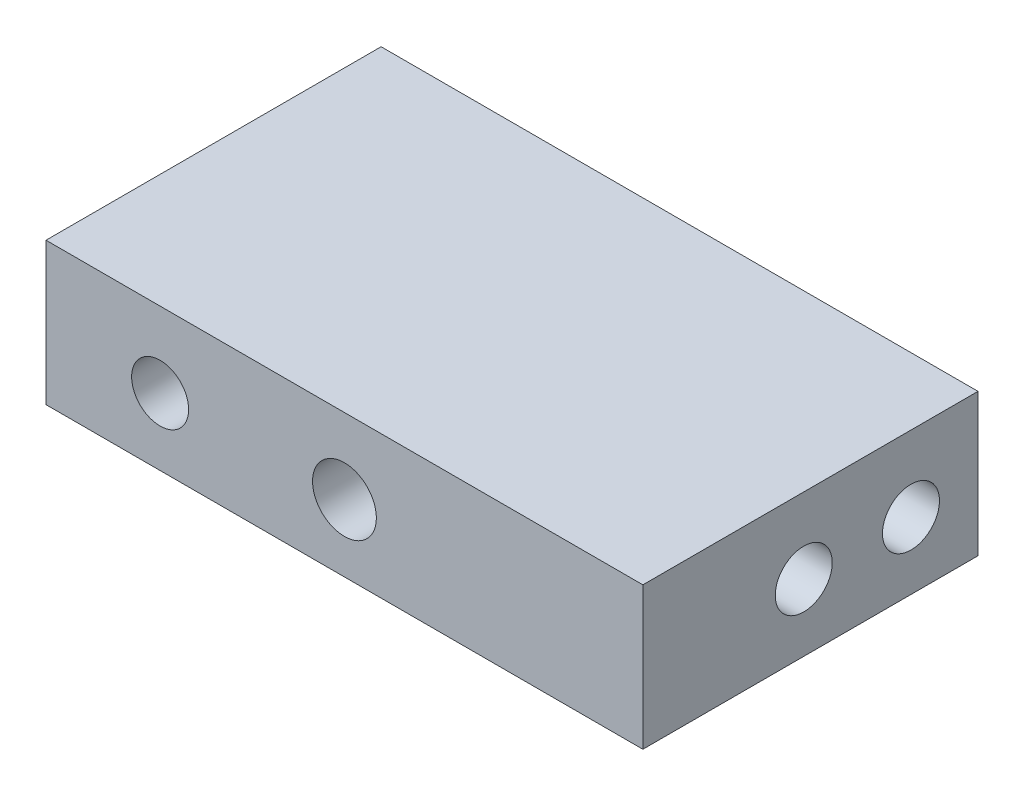
ISO-10303-21;
HEADER;
FILE_DESCRIPTION(('STEP AP214'),'2;1');
FILE_NAME('part.step','',(''),(''),'','','');
FILE_SCHEMA(('AUTOMOTIVE_DESIGN { 1 0 10303 214 1 1 1 1 }'));
ENDSEC;
DATA;
#1=APPLICATION_CONTEXT('core data for automotive mechanical design processes');
#2=APPLICATION_PROTOCOL_DEFINITION('international standard','automotive_design',2000,#1);
#3=PRODUCT_CONTEXT('',#1,'mechanical');
#4=PRODUCT('Part','Part','',(#3));
#5=PRODUCT_RELATED_PRODUCT_CATEGORY('part','',(#4));
#6=PRODUCT_DEFINITION_FORMATION('','',#4);
#7=PRODUCT_DEFINITION_CONTEXT('part definition',#1,'design');
#8=PRODUCT_DEFINITION('design','',#6,#7);
#9=PRODUCT_DEFINITION_SHAPE('','',#8);
#10=(LENGTH_UNIT() NAMED_UNIT(*) SI_UNIT(.MILLI.,.METRE.));
#11=(NAMED_UNIT(*) PLANE_ANGLE_UNIT() SI_UNIT($,.RADIAN.));
#12=(NAMED_UNIT(*) SI_UNIT($,.STERADIAN.) SOLID_ANGLE_UNIT());
#13=UNCERTAINTY_MEASURE_WITH_UNIT(LENGTH_MEASURE(1.E-05),#10,'distance_accuracy_value','');
#14=(GEOMETRIC_REPRESENTATION_CONTEXT(3) GLOBAL_UNCERTAINTY_ASSIGNED_CONTEXT((#13)) GLOBAL_UNIT_ASSIGNED_CONTEXT((#10,
#11,#12)) REPRESENTATION_CONTEXT('',''));
#15=CARTESIAN_POINT('',(0.,0.,0.));
#16=DIRECTION('',(0.,0.,1.));
#17=DIRECTION('',(1.,0.,0.));
#18=AXIS2_PLACEMENT_3D('',#15,#16,#17);
#19=CARTESIAN_POINT('',(-28.275,6.35,31.75));
#20=DIRECTION('',(1.,0.,0.));
#21=DIRECTION('',(0.,0.,-1.));
#22=AXIS2_PLACEMENT_3D('',#19,#20,#21);
#23=PLANE('',#22);
#24=CARTESIAN_POINT('',(-28.275,0.,6.35));
#25=DIRECTION('',(-1.,0.,0.));
#26=DIRECTION('',(0.,0.,1.));
#27=AXIS2_PLACEMENT_3D('',#24,#25,#26);
#28=CIRCLE('',#27,2.7);
#29=CARTESIAN_POINT('',(-28.275,0.,9.05));
#30=VERTEX_POINT('',#29);
#31=EDGE_CURVE('E119',#30,#30,#28,.T.);
#32=ORIENTED_EDGE('',*,*,#31,.F.);
#33=EDGE_LOOP('',(#32));
#34=FACE_BOUND('',#33,.T.);
#35=CARTESIAN_POINT('',(-28.275,0.,16.51));
#36=DIRECTION('',(-1.,0.,0.));
#37=DIRECTION('',(0.,0.,1.));
#38=AXIS2_PLACEMENT_3D('',#35,#36,#37);
#39=CIRCLE('',#38,2.7);
#40=CARTESIAN_POINT('',(-28.275,0.,19.21));
#41=VERTEX_POINT('',#40);
#42=EDGE_CURVE('E114',#41,#41,#39,.T.);
#43=ORIENTED_EDGE('',*,*,#42,.F.);
#44=EDGE_LOOP('',(#43));
#45=FACE_BOUND('',#44,.T.);
#46=DIRECTION('',(0.,-1.,0.));
#47=VECTOR('',#46,1.);
#48=CARTESIAN_POINT('',(-28.275,6.35,0.));
#49=LINE('',#48,#47);
#50=CARTESIAN_POINT('',(-28.275,7.14375,0.));
#51=VERTEX_POINT('',#50);
#52=CARTESIAN_POINT('',(-28.275,-6.35,0.));
#53=VERTEX_POINT('',#52);
#54=EDGE_CURVE('E95',#51,#53,#49,.T.);
#55=ORIENTED_EDGE('',*,*,#54,.T.);
#56=DIRECTION('',(0.,0.,-1.));
#57=VECTOR('',#56,1.);
#58=CARTESIAN_POINT('',(-28.275,-6.35,31.75));
#59=LINE('',#58,#57);
#60=CARTESIAN_POINT('',(-28.275,-6.35,31.75));
#61=VERTEX_POINT('',#60);
#62=EDGE_CURVE('E11',#61,#53,#59,.T.);
#63=ORIENTED_EDGE('',*,*,#62,.F.);
#64=DIRECTION('',(0.,-1.,0.));
#65=VECTOR('',#64,1.);
#66=CARTESIAN_POINT('',(-28.275,6.35,31.75));
#67=LINE('',#66,#65);
#68=CARTESIAN_POINT('',(-28.275,7.14375,31.75));
#69=VERTEX_POINT('',#68);
#70=EDGE_CURVE('E58',#69,#61,#67,.T.);
#71=ORIENTED_EDGE('',*,*,#70,.F.);
#72=DIRECTION('',(0.,0.,1.));
#73=VECTOR('',#72,1.);
#74=CARTESIAN_POINT('',(-28.275,7.14375,0.));
#75=LINE('',#74,#73);
#76=EDGE_CURVE('E99',#51,#69,#75,.T.);
#77=ORIENTED_EDGE('',*,*,#76,.F.);
#78=EDGE_LOOP('',(#55,#63,#71,#77));
#79=FACE_BOUND('',#78,.T.);
#80=ADVANCED_FACE('F41',(#34,#45,#79),#23,.F.);
#81=CARTESIAN_POINT('',(-28.275,-6.35,31.75));
#82=DIRECTION('',(0.,1.,0.));
#83=DIRECTION('',(0.,0.,1.));
#84=AXIS2_PLACEMENT_3D('',#81,#82,#83);
#85=PLANE('',#84);
#86=DIRECTION('',(1.,0.,0.));
#87=VECTOR('',#86,1.);
#88=CARTESIAN_POINT('',(-28.275,-6.35,0.));
#89=LINE('',#88,#87);
#90=CARTESIAN_POINT('',(28.275,-6.35,0.));
#91=VERTEX_POINT('',#90);
#92=EDGE_CURVE('E89',#53,#91,#89,.T.);
#93=ORIENTED_EDGE('',*,*,#92,.T.);
#94=DIRECTION('',(0.,0.,-1.));
#95=VECTOR('',#94,1.);
#96=CARTESIAN_POINT('',(28.275,-6.35,31.75));
#97=LINE('',#96,#95);
#98=CARTESIAN_POINT('',(28.275,-6.35,31.75));
#99=VERTEX_POINT('',#98);
#100=EDGE_CURVE('E45',#99,#91,#97,.T.);
#101=ORIENTED_EDGE('',*,*,#100,.F.);
#102=DIRECTION('',(1.,0.,0.));
#103=VECTOR('',#102,1.);
#104=CARTESIAN_POINT('',(-28.275,-6.35,31.75));
#105=LINE('',#104,#103);
#106=EDGE_CURVE('E138',#61,#99,#105,.T.);
#107=ORIENTED_EDGE('',*,*,#106,.F.);
#108=ORIENTED_EDGE('',*,*,#62,.T.);
#109=EDGE_LOOP('',(#93,#101,#107,#108));
#110=FACE_BOUND('',#109,.T.);
#111=ADVANCED_FACE('F145',(#110),#85,.F.);
#112=CARTESIAN_POINT('',(28.275,6.35,31.75));
#113=DIRECTION('',(1.,0.,0.));
#114=DIRECTION('',(0.,1.,0.));
#115=AXIS2_PLACEMENT_3D('',#112,#113,#114);
#116=PLANE('',#115);
#117=CARTESIAN_POINT('',(28.275,0.,6.35));
#118=DIRECTION('',(-1.,0.,0.));
#119=DIRECTION('',(0.,0.,1.));
#120=AXIS2_PLACEMENT_3D('',#117,#118,#119);
#121=CIRCLE('',#120,2.7);
#122=CARTESIAN_POINT('',(28.275,0.,9.05));
#123=VERTEX_POINT('',#122);
#124=EDGE_CURVE('E106',#123,#123,#121,.T.);
#125=ORIENTED_EDGE('',*,*,#124,.T.);
#126=EDGE_LOOP('',(#125));
#127=FACE_BOUND('',#126,.T.);
#128=CARTESIAN_POINT('',(28.275,0.,16.51));
#129=DIRECTION('',(-1.,0.,0.));
#130=DIRECTION('',(0.,0.,1.));
#131=AXIS2_PLACEMENT_3D('',#128,#129,#130);
#132=CIRCLE('',#131,2.7);
#133=CARTESIAN_POINT('',(28.275,0.,19.21));
#134=VERTEX_POINT('',#133);
#135=EDGE_CURVE('E109',#134,#134,#132,.T.);
#136=ORIENTED_EDGE('',*,*,#135,.T.);
#137=EDGE_LOOP('',(#136));
#138=FACE_BOUND('',#137,.T.);
#139=DIRECTION('',(0.,-1.,0.));
#140=VECTOR('',#139,1.);
#141=CARTESIAN_POINT('',(28.275,6.35,0.));
#142=LINE('',#141,#140);
#143=CARTESIAN_POINT('',(28.275,7.14375,0.));
#144=VERTEX_POINT('',#143);
#145=EDGE_CURVE('E83',#144,#91,#142,.T.);
#146=ORIENTED_EDGE('',*,*,#145,.F.);
#147=DIRECTION('',(0.,0.,-1.));
#148=VECTOR('',#147,1.);
#149=CARTESIAN_POINT('',(28.275,7.14375,31.75));
#150=LINE('',#149,#148);
#151=CARTESIAN_POINT('',(28.275,7.14375,31.75));
#152=VERTEX_POINT('',#151);
#153=EDGE_CURVE('E86',#152,#144,#150,.T.);
#154=ORIENTED_EDGE('',*,*,#153,.F.);
#155=DIRECTION('',(0.,-1.,0.));
#156=VECTOR('',#155,1.);
#157=CARTESIAN_POINT('',(28.275,6.35,31.75));
#158=LINE('',#157,#156);
#159=EDGE_CURVE('E73',#152,#99,#158,.T.);
#160=ORIENTED_EDGE('',*,*,#159,.T.);
#161=ORIENTED_EDGE('',*,*,#100,.T.);
#162=EDGE_LOOP('',(#146,#154,#160,#161));
#163=FACE_BOUND('',#162,.T.);
#164=ADVANCED_FACE('F43',(#127,#138,#163),#116,.T.);
#165=CARTESIAN_POINT('',(0.,0.,31.75));
#166=DIRECTION('',(0.,0.,-1.));
#167=DIRECTION('',(-1.,0.,0.));
#168=AXIS2_PLACEMENT_3D('',#165,#166,#167);
#169=PLANE('',#168);
#170=CARTESIAN_POINT('',(-17.4625,0.,31.75));
#171=DIRECTION('',(0.,0.,1.));
#172=DIRECTION('',(1.,0.,0.));
#173=AXIS2_PLACEMENT_3D('',#170,#171,#172);
#174=CIRCLE('',#173,2.7);
#175=CARTESIAN_POINT('',(-14.7625,0.,31.75));
#176=VERTEX_POINT('',#175);
#177=EDGE_CURVE('E129',#176,#176,#174,.T.);
#178=ORIENTED_EDGE('',*,*,#177,.F.);
#179=EDGE_LOOP('',(#178));
#180=FACE_BOUND('',#179,.T.);
#181=CARTESIAN_POINT('',(0.,0.,31.75));
#182=DIRECTION('',(0.,0.,1.));
#183=DIRECTION('',(1.,0.,0.));
#184=AXIS2_PLACEMENT_3D('',#181,#182,#183);
#185=CIRCLE('',#184,3.025);
#186=CARTESIAN_POINT('',(3.025,0.,31.75));
#187=VERTEX_POINT('',#186);
#188=EDGE_CURVE('E118',#187,#187,#185,.T.);
#189=ORIENTED_EDGE('',*,*,#188,.F.);
#190=EDGE_LOOP('',(#189));
#191=FACE_BOUND('',#190,.T.);
#192=ORIENTED_EDGE('',*,*,#159,.F.);
#193=DIRECTION('',(1.,0.,0.));
#194=VECTOR('',#193,1.);
#195=CARTESIAN_POINT('',(-28.275,7.14375,31.75));
#196=LINE('',#195,#194);
#197=EDGE_CURVE('E102',#69,#152,#196,.T.);
#198=ORIENTED_EDGE('',*,*,#197,.F.);
#199=ORIENTED_EDGE('',*,*,#70,.T.);
#200=ORIENTED_EDGE('',*,*,#106,.T.);
#201=EDGE_LOOP('',(#192,#198,#199,#200));
#202=FACE_BOUND('',#201,.T.);
#203=ADVANCED_FACE('F146',(#180,#191,#202),#169,.F.);
#204=CARTESIAN_POINT('',(0.,0.,0.));
#205=DIRECTION('',(0.,0.,-1.));
#206=DIRECTION('',(-1.,0.,0.));
#207=AXIS2_PLACEMENT_3D('',#204,#205,#206);
#208=PLANE('',#207);
#209=ORIENTED_EDGE('',*,*,#54,.F.);
#210=DIRECTION('',(-1.,0.,0.));
#211=VECTOR('',#210,1.);
#212=CARTESIAN_POINT('',(28.275,7.14375,0.));
#213=LINE('',#212,#211);
#214=EDGE_CURVE('E93',#144,#51,#213,.T.);
#215=ORIENTED_EDGE('',*,*,#214,.F.);
#216=ORIENTED_EDGE('',*,*,#145,.T.);
#217=ORIENTED_EDGE('',*,*,#92,.F.);
#218=EDGE_LOOP('',(#209,#215,#216,#217));
#219=FACE_BOUND('',#218,.T.);
#220=ADVANCED_FACE('F94',(#219),#208,.T.);
#221=CARTESIAN_POINT('',(0.,0.,21.75));
#222=DIRECTION('',(0.,0.,1.));
#223=DIRECTION('',(1.,0.,0.));
#224=AXIS2_PLACEMENT_3D('',#221,#222,#223);
#225=CYLINDRICAL_SURFACE('',#224,3.025);
#226=CARTESIAN_POINT('',(0.,0.,21.75));
#227=DIRECTION('',(0.,0.,1.));
#228=DIRECTION('',(1.,0.,0.));
#229=AXIS2_PLACEMENT_3D('',#226,#227,#228);
#230=CIRCLE('',#229,3.025);
#231=CARTESIAN_POINT('',(3.025,0.,21.75));
#232=VERTEX_POINT('',#231);
#233=EDGE_CURVE('E132',#232,#232,#230,.T.);
#234=ORIENTED_EDGE('',*,*,#233,.F.);
#235=EDGE_LOOP('',(#234));
#236=FACE_BOUND('',#235,.T.);
#237=ORIENTED_EDGE('',*,*,#188,.T.);
#238=EDGE_LOOP('',(#237));
#239=FACE_BOUND('',#238,.T.);
#240=ADVANCED_FACE('F154',(#236,#239),#225,.F.);
#241=CARTESIAN_POINT('',(0.,0.,21.75));
#242=DIRECTION('',(0.,0.,1.));
#243=DIRECTION('',(1.,0.,0.));
#244=AXIS2_PLACEMENT_3D('',#241,#242,#243);
#245=PLANE('',#244);
#246=ORIENTED_EDGE('',*,*,#233,.T.);
#247=EDGE_LOOP('',(#246));
#248=FACE_BOUND('',#247,.T.);
#249=ADVANCED_FACE('F192',(#248),#245,.T.);
#250=CARTESIAN_POINT('',(-17.4625,0.,21.75));
#251=DIRECTION('',(0.,0.,1.));
#252=DIRECTION('',(1.,0.,0.));
#253=AXIS2_PLACEMENT_3D('',#250,#251,#252);
#254=CYLINDRICAL_SURFACE('',#253,2.7);
#255=CARTESIAN_POINT('',(-17.4625,0.,21.75));
#256=DIRECTION('',(0.,0.,1.));
#257=DIRECTION('',(1.,0.,0.));
#258=AXIS2_PLACEMENT_3D('',#255,#256,#257);
#259=CIRCLE('',#258,2.7);
#260=CARTESIAN_POINT('',(-14.7625,0.,21.75));
#261=VERTEX_POINT('',#260);
#262=EDGE_CURVE('E90',#261,#261,#259,.T.);
#263=ORIENTED_EDGE('',*,*,#262,.F.);
#264=EDGE_LOOP('',(#263));
#265=FACE_BOUND('',#264,.T.);
#266=ORIENTED_EDGE('',*,*,#177,.T.);
#267=EDGE_LOOP('',(#266));
#268=FACE_BOUND('',#267,.T.);
#269=ADVANCED_FACE('F184',(#265,#268),#254,.F.);
#270=CARTESIAN_POINT('',(0.,0.,21.75));
#271=DIRECTION('',(0.,0.,1.));
#272=DIRECTION('',(1.,0.,0.));
#273=AXIS2_PLACEMENT_3D('',#270,#271,#272);
#274=PLANE('',#273);
#275=ORIENTED_EDGE('',*,*,#262,.T.);
#276=EDGE_LOOP('',(#275));
#277=FACE_BOUND('',#276,.T.);
#278=ADVANCED_FACE('F174',(#277),#274,.T.);
#279=CARTESIAN_POINT('',(-20.275,0.,16.51));
#280=DIRECTION('',(-1.,0.,0.));
#281=DIRECTION('',(0.,0.,1.));
#282=AXIS2_PLACEMENT_3D('',#279,#280,#281);
#283=CYLINDRICAL_SURFACE('',#282,2.7);
#284=CARTESIAN_POINT('',(-20.275,0.,16.51));
#285=DIRECTION('',(-1.,0.,0.));
#286=DIRECTION('',(0.,0.,1.));
#287=AXIS2_PLACEMENT_3D('',#284,#285,#286);
#288=CIRCLE('',#287,2.7);
#289=CARTESIAN_POINT('',(-20.275,0.,19.21));
#290=VERTEX_POINT('',#289);
#291=EDGE_CURVE('E122',#290,#290,#288,.T.);
#292=ORIENTED_EDGE('',*,*,#291,.F.);
#293=EDGE_LOOP('',(#292));
#294=FACE_BOUND('',#293,.T.);
#295=ORIENTED_EDGE('',*,*,#42,.T.);
#296=EDGE_LOOP('',(#295));
#297=FACE_BOUND('',#296,.T.);
#298=ADVANCED_FACE('F171',(#294,#297),#283,.F.);
#299=CARTESIAN_POINT('',(-20.275,0.,0.));
#300=DIRECTION('',(-1.,0.,0.));
#301=DIRECTION('',(0.,0.,1.));
#302=AXIS2_PLACEMENT_3D('',#299,#300,#301);
#303=PLANE('',#302);
#304=ORIENTED_EDGE('',*,*,#291,.T.);
#305=EDGE_LOOP('',(#304));
#306=FACE_BOUND('',#305,.T.);
#307=ADVANCED_FACE('F173',(#306),#303,.T.);
#308=CARTESIAN_POINT('',(-20.275,0.,6.35));
#309=DIRECTION('',(-1.,0.,0.));
#310=DIRECTION('',(0.,0.,1.));
#311=AXIS2_PLACEMENT_3D('',#308,#309,#310);
#312=CYLINDRICAL_SURFACE('',#311,2.7);
#313=CARTESIAN_POINT('',(-20.275,0.,6.35));
#314=DIRECTION('',(-1.,0.,0.));
#315=DIRECTION('',(0.,0.,1.));
#316=AXIS2_PLACEMENT_3D('',#313,#314,#315);
#317=CIRCLE('',#316,2.7);
#318=CARTESIAN_POINT('',(-20.275,0.,9.05));
#319=VERTEX_POINT('',#318);
#320=EDGE_CURVE('E115',#319,#319,#317,.T.);
#321=ORIENTED_EDGE('',*,*,#320,.F.);
#322=EDGE_LOOP('',(#321));
#323=FACE_BOUND('',#322,.T.);
#324=ORIENTED_EDGE('',*,*,#31,.T.);
#325=EDGE_LOOP('',(#324));
#326=FACE_BOUND('',#325,.T.);
#327=ADVANCED_FACE('F181',(#323,#326),#312,.F.);
#328=CARTESIAN_POINT('',(-20.275,0.,0.));
#329=DIRECTION('',(-1.,0.,0.));
#330=DIRECTION('',(0.,0.,1.));
#331=AXIS2_PLACEMENT_3D('',#328,#329,#330);
#332=PLANE('',#331);
#333=ORIENTED_EDGE('',*,*,#320,.T.);
#334=EDGE_LOOP('',(#333));
#335=FACE_BOUND('',#334,.T.);
#336=ADVANCED_FACE('F246',(#335),#332,.T.);
#337=CARTESIAN_POINT('',(0.,7.14375,0.));
#338=DIRECTION('',(0.,1.,0.));
#339=DIRECTION('',(0.,0.,1.));
#340=AXIS2_PLACEMENT_3D('',#337,#338,#339);
#341=PLANE('',#340);
#342=ORIENTED_EDGE('',*,*,#153,.T.);
#343=ORIENTED_EDGE('',*,*,#214,.T.);
#344=ORIENTED_EDGE('',*,*,#76,.T.);
#345=ORIENTED_EDGE('',*,*,#197,.T.);
#346=EDGE_LOOP('',(#342,#343,#344,#345));
#347=FACE_BOUND('',#346,.T.);
#348=ADVANCED_FACE('F101',(#347),#341,.T.);
#349=CARTESIAN_POINT('',(20.275,0.,16.51));
#350=DIRECTION('',(1.,0.,0.));
#351=DIRECTION('',(0.,0.,-1.));
#352=AXIS2_PLACEMENT_3D('',#349,#350,#351);
#353=CYLINDRICAL_SURFACE('',#352,2.7);
#354=CARTESIAN_POINT('',(20.275,0.,16.51));
#355=DIRECTION('',(-1.,0.,0.));
#356=DIRECTION('',(0.,0.,1.));
#357=AXIS2_PLACEMENT_3D('',#354,#355,#356);
#358=CIRCLE('',#357,2.7);
#359=CARTESIAN_POINT('',(20.275,0.,19.21));
#360=VERTEX_POINT('',#359);
#361=EDGE_CURVE('E345',#360,#360,#358,.T.);
#362=ORIENTED_EDGE('',*,*,#361,.T.);
#363=EDGE_LOOP('',(#362));
#364=FACE_BOUND('',#363,.T.);
#365=ORIENTED_EDGE('',*,*,#135,.F.);
#366=EDGE_LOOP('',(#365));
#367=FACE_BOUND('',#366,.T.);
#368=ADVANCED_FACE('F294',(#364,#367),#353,.F.);
#369=CARTESIAN_POINT('',(20.275,0.,0.));
#370=DIRECTION('',(1.,0.,0.));
#371=DIRECTION('',(0.,0.,1.));
#372=AXIS2_PLACEMENT_3D('',#369,#370,#371);
#373=PLANE('',#372);
#374=ORIENTED_EDGE('',*,*,#361,.F.);
#375=EDGE_LOOP('',(#374));
#376=FACE_BOUND('',#375,.T.);
#377=ADVANCED_FACE('F302',(#376),#373,.T.);
#378=CARTESIAN_POINT('',(20.275,0.,6.35));
#379=DIRECTION('',(1.,0.,0.));
#380=DIRECTION('',(0.,0.,-1.));
#381=AXIS2_PLACEMENT_3D('',#378,#379,#380);
#382=CYLINDRICAL_SURFACE('',#381,2.7);
#383=CARTESIAN_POINT('',(20.275,0.,6.35));
#384=DIRECTION('',(-1.,0.,0.));
#385=DIRECTION('',(0.,0.,1.));
#386=AXIS2_PLACEMENT_3D('',#383,#384,#385);
#387=CIRCLE('',#386,2.7);
#388=CARTESIAN_POINT('',(20.275,0.,9.05));
#389=VERTEX_POINT('',#388);
#390=EDGE_CURVE('E103',#389,#389,#387,.T.);
#391=ORIENTED_EDGE('',*,*,#390,.T.);
#392=EDGE_LOOP('',(#391));
#393=FACE_BOUND('',#392,.T.);
#394=ORIENTED_EDGE('',*,*,#124,.F.);
#395=EDGE_LOOP('',(#394));
#396=FACE_BOUND('',#395,.T.);
#397=ADVANCED_FACE('F312',(#393,#396),#382,.F.);
#398=CARTESIAN_POINT('',(20.275,0.,0.));
#399=DIRECTION('',(1.,0.,0.));
#400=DIRECTION('',(0.,0.,1.));
#401=AXIS2_PLACEMENT_3D('',#398,#399,#400);
#402=PLANE('',#401);
#403=ORIENTED_EDGE('',*,*,#390,.F.);
#404=EDGE_LOOP('',(#403));
#405=FACE_BOUND('',#404,.T.);
#406=ADVANCED_FACE('F325',(#405),#402,.T.);
#407=CLOSED_SHELL('',(#80,#111,#164,#203,#220,#240,#249,#269,#278,#298,#307,#327,#336,#348,#368,
#377,#397,#406));
#408=MANIFOLD_SOLID_BREP('B2',#407);
#409=ADVANCED_BREP_SHAPE_REPRESENTATION('',(#18,#408),#14);
#410=SHAPE_DEFINITION_REPRESENTATION(#9,#409);
ENDSEC;
END-ISO-10303-21;
